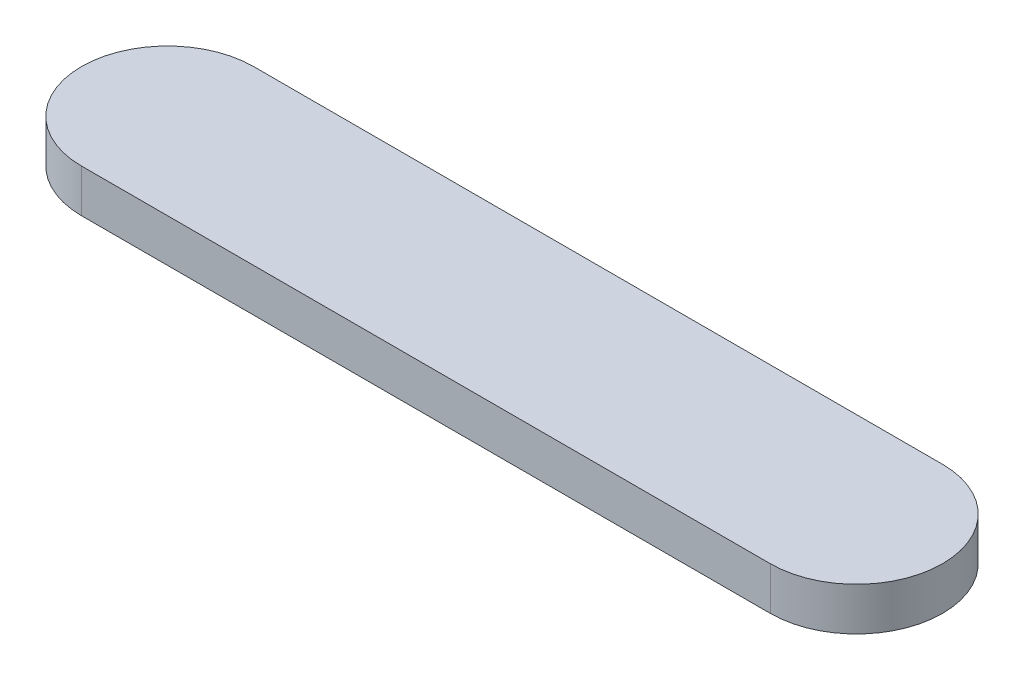
ISO-10303-21;
HEADER;
FILE_DESCRIPTION(('STEP AP214'),'2;1');
FILE_NAME('part.step','',(''),(''),'','','');
FILE_SCHEMA(('AUTOMOTIVE_DESIGN { 1 0 10303 214 1 1 1 1 }'));
ENDSEC;
DATA;
#1=APPLICATION_CONTEXT('core data for automotive mechanical design processes');
#2=APPLICATION_PROTOCOL_DEFINITION('international standard','automotive_design',2000,#1);
#3=PRODUCT_CONTEXT('',#1,'mechanical');
#4=PRODUCT('Part','Part','',(#3));
#5=PRODUCT_RELATED_PRODUCT_CATEGORY('part','',(#4));
#6=PRODUCT_DEFINITION_FORMATION('','',#4);
#7=PRODUCT_DEFINITION_CONTEXT('part definition',#1,'design');
#8=PRODUCT_DEFINITION('design','',#6,#7);
#9=PRODUCT_DEFINITION_SHAPE('','',#8);
#10=(LENGTH_UNIT() NAMED_UNIT(*) SI_UNIT(.MILLI.,.METRE.));
#11=(NAMED_UNIT(*) PLANE_ANGLE_UNIT() SI_UNIT($,.RADIAN.));
#12=(NAMED_UNIT(*) SI_UNIT($,.STERADIAN.) SOLID_ANGLE_UNIT());
#13=UNCERTAINTY_MEASURE_WITH_UNIT(LENGTH_MEASURE(1.E-05),#10,'distance_accuracy_value','');
#14=(GEOMETRIC_REPRESENTATION_CONTEXT(3) GLOBAL_UNCERTAINTY_ASSIGNED_CONTEXT((#13)) GLOBAL_UNIT_ASSIGNED_CONTEXT((#10,
#11,#12)) REPRESENTATION_CONTEXT('',''));
#15=CARTESIAN_POINT('',(0.,0.,0.));
#16=DIRECTION('',(0.,0.,1.));
#17=DIRECTION('',(1.,0.,0.));
#18=AXIS2_PLACEMENT_3D('',#15,#16,#17);
#19=CARTESIAN_POINT('',(0.,25.,0.));
#20=DIRECTION('',(0.,-1.,0.));
#21=DIRECTION('',(0.,0.,-1.));
#22=AXIS2_PLACEMENT_3D('',#19,#20,#21);
#23=CYLINDRICAL_SURFACE('',#22,50.);
#24=CARTESIAN_POINT('',(0.,0.,0.));
#25=DIRECTION('',(0.,1.,0.));
#26=DIRECTION('',(0.,0.,1.));
#27=AXIS2_PLACEMENT_3D('',#24,#25,#26);
#28=CIRCLE('',#27,50.);
#29=CARTESIAN_POINT('',(0.,0.,-50.));
#30=VERTEX_POINT('',#29);
#31=CARTESIAN_POINT('',(0.,0.,50.));
#32=VERTEX_POINT('',#31);
#33=EDGE_CURVE('E111',#30,#32,#28,.T.);
#34=ORIENTED_EDGE('',*,*,#33,.T.);
#35=DIRECTION('',(0.,-1.,0.));
#36=VECTOR('',#35,1.);
#37=CARTESIAN_POINT('',(0.,25.,50.));
#38=LINE('',#37,#36);
#39=CARTESIAN_POINT('',(0.,25.,50.));
#40=VERTEX_POINT('',#39);
#41=EDGE_CURVE('E11',#40,#32,#38,.T.);
#42=ORIENTED_EDGE('',*,*,#41,.F.);
#43=CARTESIAN_POINT('',(0.,25.,0.));
#44=DIRECTION('',(0.,1.,0.));
#45=DIRECTION('',(0.,0.,1.));
#46=AXIS2_PLACEMENT_3D('',#43,#44,#45);
#47=CIRCLE('',#46,50.);
#48=CARTESIAN_POINT('',(0.,25.,-50.));
#49=VERTEX_POINT('',#48);
#50=EDGE_CURVE('E95',#49,#40,#47,.T.);
#51=ORIENTED_EDGE('',*,*,#50,.F.);
#52=DIRECTION('',(0.,-1.,0.));
#53=VECTOR('',#52,1.);
#54=CARTESIAN_POINT('',(0.,25.,-50.));
#55=LINE('',#54,#53);
#56=EDGE_CURVE('E107',#49,#30,#55,.T.);
#57=ORIENTED_EDGE('',*,*,#56,.T.);
#58=EDGE_LOOP('',(#34,#42,#51,#57));
#59=FACE_BOUND('',#58,.T.);
#60=ADVANCED_FACE('F43',(#59),#23,.T.);
#61=CARTESIAN_POINT('',(0.,25.,50.));
#62=DIRECTION('',(0.,0.,-1.));
#63=DIRECTION('',(-1.,0.,0.));
#64=AXIS2_PLACEMENT_3D('',#61,#62,#63);
#65=PLANE('',#64);
#66=DIRECTION('',(1.,0.,0.));
#67=VECTOR('',#66,1.);
#68=CARTESIAN_POINT('',(0.,0.,50.));
#69=LINE('',#68,#67);
#70=CARTESIAN_POINT('',(400.,0.,50.));
#71=VERTEX_POINT('',#70);
#72=EDGE_CURVE('E100',#32,#71,#69,.T.);
#73=ORIENTED_EDGE('',*,*,#72,.T.);
#74=DIRECTION('',(0.,-1.,0.));
#75=VECTOR('',#74,1.);
#76=CARTESIAN_POINT('',(400.,25.,50.));
#77=LINE('',#76,#75);
#78=CARTESIAN_POINT('',(400.,25.,50.));
#79=VERTEX_POINT('',#78);
#80=EDGE_CURVE('E52',#79,#71,#77,.T.);
#81=ORIENTED_EDGE('',*,*,#80,.F.);
#82=DIRECTION('',(1.,0.,0.));
#83=VECTOR('',#82,1.);
#84=CARTESIAN_POINT('',(0.,25.,50.));
#85=LINE('',#84,#83);
#86=EDGE_CURVE('E90',#40,#79,#85,.T.);
#87=ORIENTED_EDGE('',*,*,#86,.F.);
#88=ORIENTED_EDGE('',*,*,#41,.T.);
#89=EDGE_LOOP('',(#73,#81,#87,#88));
#90=FACE_BOUND('',#89,.T.);
#91=ADVANCED_FACE('F99',(#90),#65,.F.);
#92=CARTESIAN_POINT('',(400.,25.,0.));
#93=DIRECTION('',(0.,-1.,0.));
#94=DIRECTION('',(0.,0.,-1.));
#95=AXIS2_PLACEMENT_3D('',#92,#93,#94);
#96=CYLINDRICAL_SURFACE('',#95,50.);
#97=CARTESIAN_POINT('',(400.,0.,0.));
#98=DIRECTION('',(0.,1.,0.));
#99=DIRECTION('',(0.,0.,1.));
#100=AXIS2_PLACEMENT_3D('',#97,#98,#99);
#101=CIRCLE('',#100,50.);
#102=CARTESIAN_POINT('',(400.,0.,-50.));
#103=VERTEX_POINT('',#102);
#104=EDGE_CURVE('E77',#71,#103,#101,.T.);
#105=ORIENTED_EDGE('',*,*,#104,.T.);
#106=DIRECTION('',(0.,-1.,0.));
#107=VECTOR('',#106,1.);
#108=CARTESIAN_POINT('',(400.,25.,-50.));
#109=LINE('',#108,#107);
#110=CARTESIAN_POINT('',(400.,25.,-50.));
#111=VERTEX_POINT('',#110);
#112=EDGE_CURVE('E102',#111,#103,#109,.T.);
#113=ORIENTED_EDGE('',*,*,#112,.F.);
#114=CARTESIAN_POINT('',(400.,25.,0.));
#115=DIRECTION('',(0.,1.,0.));
#116=DIRECTION('',(0.,0.,1.));
#117=AXIS2_PLACEMENT_3D('',#114,#115,#116);
#118=CIRCLE('',#117,50.);
#119=EDGE_CURVE('E93',#79,#111,#118,.T.);
#120=ORIENTED_EDGE('',*,*,#119,.F.);
#121=ORIENTED_EDGE('',*,*,#80,.T.);
#122=EDGE_LOOP('',(#105,#113,#120,#121));
#123=FACE_BOUND('',#122,.T.);
#124=ADVANCED_FACE('F103',(#123),#96,.T.);
#125=CARTESIAN_POINT('',(0.,25.,-50.));
#126=DIRECTION('',(0.,0.,1.));
#127=DIRECTION('',(1.,0.,0.));
#128=AXIS2_PLACEMENT_3D('',#125,#126,#127);
#129=PLANE('',#128);
#130=DIRECTION('',(-1.,0.,0.));
#131=VECTOR('',#130,1.);
#132=CARTESIAN_POINT('',(0.,0.,-50.));
#133=LINE('',#132,#131);
#134=EDGE_CURVE('E83',#103,#30,#133,.T.);
#135=ORIENTED_EDGE('',*,*,#134,.T.);
#136=ORIENTED_EDGE('',*,*,#56,.F.);
#137=DIRECTION('',(-1.,0.,0.));
#138=VECTOR('',#137,1.);
#139=CARTESIAN_POINT('',(0.,25.,-50.));
#140=LINE('',#139,#138);
#141=EDGE_CURVE('E60',#111,#49,#140,.T.);
#142=ORIENTED_EDGE('',*,*,#141,.F.);
#143=ORIENTED_EDGE('',*,*,#112,.T.);
#144=EDGE_LOOP('',(#135,#136,#142,#143));
#145=FACE_BOUND('',#144,.T.);
#146=ADVANCED_FACE('F124',(#145),#129,.F.);
#147=CARTESIAN_POINT('',(0.,25.,0.));
#148=DIRECTION('',(0.,1.,0.));
#149=DIRECTION('',(0.,0.,1.));
#150=AXIS2_PLACEMENT_3D('',#147,#148,#149);
#151=PLANE('',#150);
#152=ORIENTED_EDGE('',*,*,#50,.T.);
#153=ORIENTED_EDGE('',*,*,#86,.T.);
#154=ORIENTED_EDGE('',*,*,#119,.T.);
#155=ORIENTED_EDGE('',*,*,#141,.T.);
#156=EDGE_LOOP('',(#152,#153,#154,#155));
#157=FACE_BOUND('',#156,.T.);
#158=ADVANCED_FACE('F91',(#157),#151,.T.);
#159=CARTESIAN_POINT('',(0.,0.,0.));
#160=DIRECTION('',(0.,1.,0.));
#161=DIRECTION('',(0.,0.,1.));
#162=AXIS2_PLACEMENT_3D('',#159,#160,#161);
#163=PLANE('',#162);
#164=ORIENTED_EDGE('',*,*,#33,.F.);
#165=ORIENTED_EDGE('',*,*,#134,.F.);
#166=ORIENTED_EDGE('',*,*,#104,.F.);
#167=ORIENTED_EDGE('',*,*,#72,.F.);
#168=EDGE_LOOP('',(#164,#165,#166,#167));
#169=FACE_BOUND('',#168,.T.);
#170=ADVANCED_FACE('F127',(#169),#163,.F.);
#171=CLOSED_SHELL('',(#60,#91,#124,#146,#158,#170));
#172=MANIFOLD_SOLID_BREP('B2',#171);
#173=ADVANCED_BREP_SHAPE_REPRESENTATION('',(#18,#172),#14);
#174=SHAPE_DEFINITION_REPRESENTATION(#9,#173);
ENDSEC;
END-ISO-10303-21;
